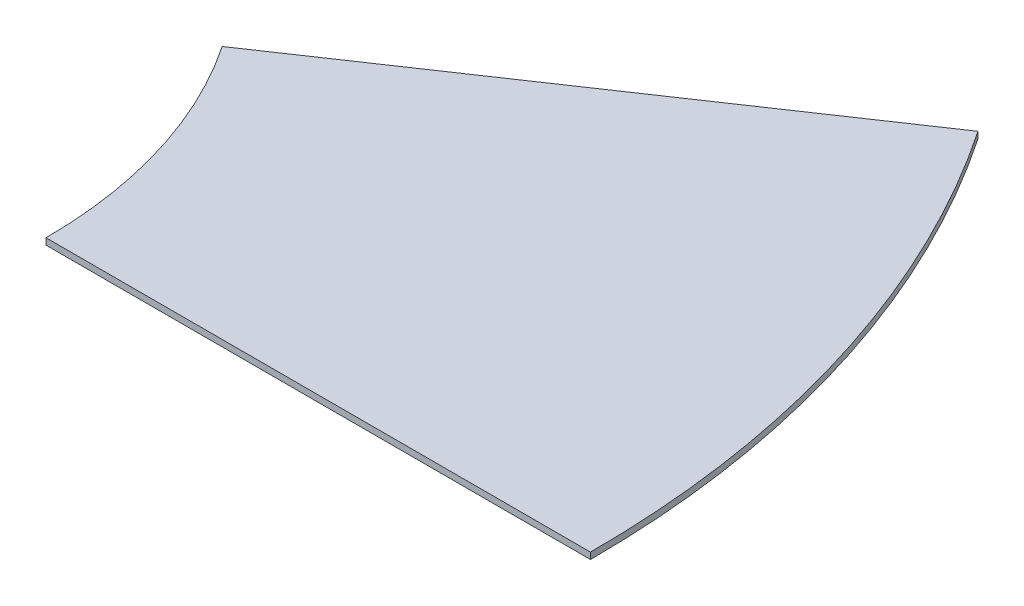
ISO-10303-21;
HEADER;
FILE_DESCRIPTION(('STEP AP214'),'2;1');
FILE_NAME('part.step','',(''),(''),'','','');
FILE_SCHEMA(('AUTOMOTIVE_DESIGN { 1 0 10303 214 1 1 1 1 }'));
ENDSEC;
DATA;
#1=APPLICATION_CONTEXT('core data for automotive mechanical design processes');
#2=APPLICATION_PROTOCOL_DEFINITION('international standard','automotive_design',2000,#1);
#3=PRODUCT_CONTEXT('',#1,'mechanical');
#4=PRODUCT('Part','Part','',(#3));
#5=PRODUCT_RELATED_PRODUCT_CATEGORY('part','',(#4));
#6=PRODUCT_DEFINITION_FORMATION('','',#4);
#7=PRODUCT_DEFINITION_CONTEXT('part definition',#1,'design');
#8=PRODUCT_DEFINITION('design','',#6,#7);
#9=PRODUCT_DEFINITION_SHAPE('','',#8);
#10=(LENGTH_UNIT() NAMED_UNIT(*) SI_UNIT(.MILLI.,.METRE.));
#11=(NAMED_UNIT(*) PLANE_ANGLE_UNIT() SI_UNIT($,.RADIAN.));
#12=(NAMED_UNIT(*) SI_UNIT($,.STERADIAN.) SOLID_ANGLE_UNIT());
#13=UNCERTAINTY_MEASURE_WITH_UNIT(LENGTH_MEASURE(1.E-05),#10,'distance_accuracy_value','');
#14=(GEOMETRIC_REPRESENTATION_CONTEXT(3) GLOBAL_UNCERTAINTY_ASSIGNED_CONTEXT((#13)) GLOBAL_UNIT_ASSIGNED_CONTEXT((#10,
#11,#12)) REPRESENTATION_CONTEXT('',''));
#15=CARTESIAN_POINT('',(0.,0.,0.));
#16=DIRECTION('',(0.,0.,1.));
#17=DIRECTION('',(1.,0.,0.));
#18=AXIS2_PLACEMENT_3D('',#15,#16,#17);
#19=CARTESIAN_POINT('',(0.,0.71,0.));
#20=DIRECTION('',(0.,-1.,0.));
#21=DIRECTION('',(0.,0.,-1.));
#22=AXIS2_PLACEMENT_3D('',#19,#20,#21);
#23=CYLINDRICAL_SURFACE('',#22,110.);
#24=CARTESIAN_POINT('',(0.,0.,0.));
#25=DIRECTION('',(0.,1.,0.));
#26=DIRECTION('',(0.,0.,1.));
#27=AXIS2_PLACEMENT_3D('',#24,#25,#26);
#28=CIRCLE('',#27,110.);
#29=CARTESIAN_POINT('',(110.,0.,0.));
#30=VERTEX_POINT('',#29);
#31=CARTESIAN_POINT('',(91.1941329810549,0.,-61.5112193817816));
#32=VERTEX_POINT('',#31);
#33=EDGE_CURVE('E97',#30,#32,#28,.T.);
#34=ORIENTED_EDGE('',*,*,#33,.T.);
#35=DIRECTION('',(0.,-1.,0.));
#36=VECTOR('',#35,1.);
#37=CARTESIAN_POINT('',(91.1941329810549,0.71,-61.5112193817816));
#38=LINE('',#37,#36);
#39=CARTESIAN_POINT('',(91.1941329810549,0.71,-61.5112193817816));
#40=VERTEX_POINT('',#39);
#41=EDGE_CURVE('E11',#40,#32,#38,.T.);
#42=ORIENTED_EDGE('',*,*,#41,.F.);
#43=CARTESIAN_POINT('',(0.,0.71,0.));
#44=DIRECTION('',(0.,1.,0.));
#45=DIRECTION('',(0.,0.,1.));
#46=AXIS2_PLACEMENT_3D('',#43,#44,#45);
#47=CIRCLE('',#46,110.);
#48=CARTESIAN_POINT('',(110.,0.71,0.));
#49=VERTEX_POINT('',#48);
#50=EDGE_CURVE('E83',#49,#40,#47,.T.);
#51=ORIENTED_EDGE('',*,*,#50,.F.);
#52=DIRECTION('',(0.,-1.,0.));
#53=VECTOR('',#52,1.);
#54=CARTESIAN_POINT('',(110.,0.71,0.));
#55=LINE('',#54,#53);
#56=EDGE_CURVE('E50',#49,#30,#55,.T.);
#57=ORIENTED_EDGE('',*,*,#56,.T.);
#58=EDGE_LOOP('',(#34,#42,#51,#57));
#59=FACE_BOUND('',#58,.T.);
#60=ADVANCED_FACE('F34',(#59),#23,.T.);
#61=CARTESIAN_POINT('',(91.1941329810549,0.71,-61.5112193817816));
#62=DIRECTION('',(0.559192903470742,0.,0.829037572555045));
#63=DIRECTION('',(0.829037572555045,0.,-0.559192903470742));
#64=AXIS2_PLACEMENT_3D('',#61,#62,#63);
#65=PLANE('',#64);
#66=DIRECTION('',(-0.829037572555045,0.,0.559192903470742));
#67=VECTOR('',#66,1.);
#68=CARTESIAN_POINT('',(91.1941329810549,0.,-61.5112193817816));
#69=LINE('',#68,#67);
#70=CARTESIAN_POINT('',(41.4518786277522,0.,-27.9596451735371));
#71=VERTEX_POINT('',#70);
#72=EDGE_CURVE('E88',#32,#71,#69,.T.);
#73=ORIENTED_EDGE('',*,*,#72,.T.);
#74=DIRECTION('',(0.,-1.,0.));
#75=VECTOR('',#74,1.);
#76=CARTESIAN_POINT('',(41.4518786277522,0.71,-27.9596451735371));
#77=LINE('',#76,#75);
#78=CARTESIAN_POINT('',(41.4518786277522,0.71,-27.9596451735371));
#79=VERTEX_POINT('',#78);
#80=EDGE_CURVE('E42',#79,#71,#77,.T.);
#81=ORIENTED_EDGE('',*,*,#80,.F.);
#82=DIRECTION('',(-0.829037572555045,0.,0.559192903470742));
#83=VECTOR('',#82,1.);
#84=CARTESIAN_POINT('',(91.1941329810549,0.71,-61.5112193817816));
#85=LINE('',#84,#83);
#86=EDGE_CURVE('E75',#40,#79,#85,.T.);
#87=ORIENTED_EDGE('',*,*,#86,.F.);
#88=ORIENTED_EDGE('',*,*,#41,.T.);
#89=EDGE_LOOP('',(#73,#81,#87,#88));
#90=FACE_BOUND('',#89,.T.);
#91=ADVANCED_FACE('F87',(#90),#65,.F.);
#92=CARTESIAN_POINT('',(0.,0.71,0.));
#93=DIRECTION('',(0.,-1.,0.));
#94=DIRECTION('',(0.,0.,-1.));
#95=AXIS2_PLACEMENT_3D('',#92,#93,#94);
#96=CYLINDRICAL_SURFACE('',#95,50.);
#97=CARTESIAN_POINT('',(0.,0.,0.));
#98=DIRECTION('',(0.,1.,0.));
#99=DIRECTION('',(0.,0.,1.));
#100=AXIS2_PLACEMENT_3D('',#97,#98,#99);
#101=CIRCLE('',#100,50.);
#102=CARTESIAN_POINT('',(50.,0.,0.));
#103=VERTEX_POINT('',#102);
#104=EDGE_CURVE('E100',#103,#71,#101,.T.);
#105=ORIENTED_EDGE('',*,*,#104,.F.);
#106=DIRECTION('',(0.,-1.,0.));
#107=VECTOR('',#106,1.);
#108=CARTESIAN_POINT('',(50.,0.71,0.));
#109=LINE('',#108,#107);
#110=CARTESIAN_POINT('',(50.,0.71,0.));
#111=VERTEX_POINT('',#110);
#112=EDGE_CURVE('E64',#111,#103,#109,.T.);
#113=ORIENTED_EDGE('',*,*,#112,.F.);
#114=CARTESIAN_POINT('',(0.,0.71,0.));
#115=DIRECTION('',(0.,1.,0.));
#116=DIRECTION('',(0.,0.,1.));
#117=AXIS2_PLACEMENT_3D('',#114,#115,#116);
#118=CIRCLE('',#117,50.);
#119=EDGE_CURVE('E82',#111,#79,#118,.T.);
#120=ORIENTED_EDGE('',*,*,#119,.T.);
#121=ORIENTED_EDGE('',*,*,#80,.T.);
#122=EDGE_LOOP('',(#105,#113,#120,#121));
#123=FACE_BOUND('',#122,.T.);
#124=ADVANCED_FACE('F91',(#123),#96,.F.);
#125=CARTESIAN_POINT('',(110.,0.71,0.));
#126=DIRECTION('',(0.,0.,1.));
#127=DIRECTION('',(1.,0.,0.));
#128=AXIS2_PLACEMENT_3D('',#125,#126,#127);
#129=PLANE('',#128);
#130=DIRECTION('',(-1.,0.,0.));
#131=VECTOR('',#130,1.);
#132=CARTESIAN_POINT('',(110.,0.,0.));
#133=LINE('',#132,#131);
#134=EDGE_CURVE('E102',#30,#103,#133,.T.);
#135=ORIENTED_EDGE('',*,*,#134,.F.);
#136=ORIENTED_EDGE('',*,*,#56,.F.);
#137=DIRECTION('',(-1.,0.,0.));
#138=VECTOR('',#137,1.);
#139=CARTESIAN_POINT('',(110.,0.71,0.));
#140=LINE('',#139,#138);
#141=EDGE_CURVE('E92',#49,#111,#140,.T.);
#142=ORIENTED_EDGE('',*,*,#141,.T.);
#143=ORIENTED_EDGE('',*,*,#112,.T.);
#144=EDGE_LOOP('',(#135,#136,#142,#143));
#145=FACE_BOUND('',#144,.T.);
#146=ADVANCED_FACE('F108',(#145),#129,.T.);
#147=CARTESIAN_POINT('',(0.,0.71,0.));
#148=DIRECTION('',(0.,1.,0.));
#149=DIRECTION('',(0.,0.,1.));
#150=AXIS2_PLACEMENT_3D('',#147,#148,#149);
#151=PLANE('',#150);
#152=ORIENTED_EDGE('',*,*,#50,.T.);
#153=ORIENTED_EDGE('',*,*,#86,.T.);
#154=ORIENTED_EDGE('',*,*,#119,.F.);
#155=ORIENTED_EDGE('',*,*,#141,.F.);
#156=EDGE_LOOP('',(#152,#153,#154,#155));
#157=FACE_BOUND('',#156,.T.);
#158=ADVANCED_FACE('F79',(#157),#151,.T.);
#159=CARTESIAN_POINT('',(0.,0.,0.));
#160=DIRECTION('',(0.,1.,0.));
#161=DIRECTION('',(0.,0.,1.));
#162=AXIS2_PLACEMENT_3D('',#159,#160,#161);
#163=PLANE('',#162);
#164=ORIENTED_EDGE('',*,*,#33,.F.);
#165=ORIENTED_EDGE('',*,*,#134,.T.);
#166=ORIENTED_EDGE('',*,*,#104,.T.);
#167=ORIENTED_EDGE('',*,*,#72,.F.);
#168=EDGE_LOOP('',(#164,#165,#166,#167));
#169=FACE_BOUND('',#168,.T.);
#170=ADVANCED_FACE('F107',(#169),#163,.F.);
#171=CLOSED_SHELL('',(#60,#91,#124,#146,#158,#170));
#172=MANIFOLD_SOLID_BREP('B2',#171);
#173=ADVANCED_BREP_SHAPE_REPRESENTATION('',(#18,#172),#14);
#174=SHAPE_DEFINITION_REPRESENTATION(#9,#173);
ENDSEC;
END-ISO-10303-21;
